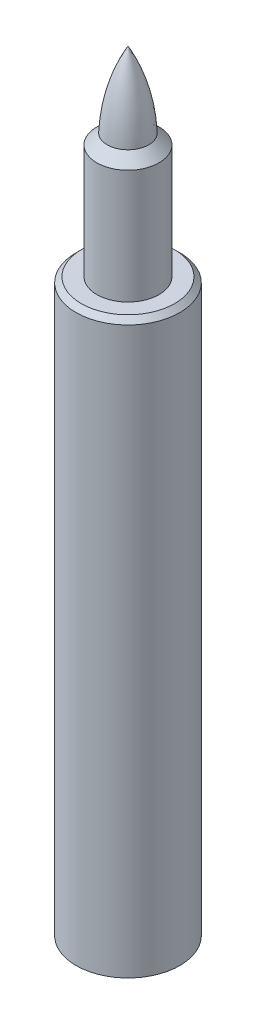
ISO-10303-21;
HEADER;
FILE_DESCRIPTION(('STEP AP214'),'2;1');
FILE_NAME('part.step','',(''),(''),'','','');
FILE_SCHEMA(('AUTOMOTIVE_DESIGN { 1 0 10303 214 1 1 1 1 }'));
ENDSEC;
DATA;
#1=APPLICATION_CONTEXT('core data for automotive mechanical design processes');
#2=APPLICATION_PROTOCOL_DEFINITION('international standard','automotive_design',2000,#1);
#3=PRODUCT_CONTEXT('',#1,'mechanical');
#4=PRODUCT('Part','Part','',(#3));
#5=PRODUCT_RELATED_PRODUCT_CATEGORY('part','',(#4));
#6=PRODUCT_DEFINITION_FORMATION('','',#4);
#7=PRODUCT_DEFINITION_CONTEXT('part definition',#1,'design');
#8=PRODUCT_DEFINITION('design','',#6,#7);
#9=PRODUCT_DEFINITION_SHAPE('','',#8);
#10=(LENGTH_UNIT() NAMED_UNIT(*) SI_UNIT(.MILLI.,.METRE.));
#11=(NAMED_UNIT(*) PLANE_ANGLE_UNIT() SI_UNIT($,.RADIAN.));
#12=(NAMED_UNIT(*) SI_UNIT($,.STERADIAN.) SOLID_ANGLE_UNIT());
#13=UNCERTAINTY_MEASURE_WITH_UNIT(LENGTH_MEASURE(1.E-05),#10,'distance_accuracy_value','');
#14=(GEOMETRIC_REPRESENTATION_CONTEXT(3) GLOBAL_UNCERTAINTY_ASSIGNED_CONTEXT((#13)) GLOBAL_UNIT_ASSIGNED_CONTEXT((#10,
#11,#12)) REPRESENTATION_CONTEXT('',''));
#15=CARTESIAN_POINT('',(0.,0.,0.));
#16=DIRECTION('',(0.,0.,1.));
#17=DIRECTION('',(1.,0.,0.));
#18=AXIS2_PLACEMENT_3D('',#15,#16,#17);
#19=CARTESIAN_POINT('',(0.,110.,0.));
#20=DIRECTION('',(0.,-1.,0.));
#21=DIRECTION('',(0.,0.,-1.));
#22=AXIS2_PLACEMENT_3D('',#19,#20,#21);
#23=CYLINDRICAL_SURFACE('',#22,10.);
#24=CARTESIAN_POINT('',(0.,109.,0.));
#25=DIRECTION('',(0.,1.,0.));
#26=DIRECTION('',(0.,0.,1.));
#27=AXIS2_PLACEMENT_3D('',#24,#25,#26);
#28=CIRCLE('',#27,10.);
#29=CARTESIAN_POINT('',(0.,109.,10.));
#30=VERTEX_POINT('',#29);
#31=EDGE_CURVE('E11',#30,#30,#28,.F.);
#32=ORIENTED_EDGE('',*,*,#31,.T.);
#33=EDGE_LOOP('',(#32));
#34=FACE_BOUND('',#33,.T.);
#35=CARTESIAN_POINT('',(0.,0.,0.));
#36=DIRECTION('',(0.,1.,0.));
#37=DIRECTION('',(0.,0.,1.));
#38=AXIS2_PLACEMENT_3D('',#35,#36,#37);
#39=CIRCLE('',#38,10.);
#40=CARTESIAN_POINT('',(0.,0.,10.));
#41=VERTEX_POINT('',#40);
#42=EDGE_CURVE('E86',#41,#41,#39,.T.);
#43=ORIENTED_EDGE('',*,*,#42,.T.);
#44=EDGE_LOOP('',(#43));
#45=FACE_BOUND('',#44,.T.);
#46=ADVANCED_FACE('F37',(#34,#45),#23,.T.);
#47=CARTESIAN_POINT('',(0.,110.,0.));
#48=DIRECTION('',(0.,1.,0.));
#49=DIRECTION('',(0.,0.,1.));
#50=AXIS2_PLACEMENT_3D('',#47,#48,#49);
#51=PLANE('',#50);
#52=CARTESIAN_POINT('',(0.,110.,0.));
#53=DIRECTION('',(0.,1.,0.));
#54=DIRECTION('',(0.,0.,1.));
#55=AXIS2_PLACEMENT_3D('',#52,#53,#54);
#56=CIRCLE('',#55,9.00000000000004);
#57=CARTESIAN_POINT('',(0.,110.,9.00000000000004));
#58=VERTEX_POINT('',#57);
#59=EDGE_CURVE('E45',#58,#58,#56,.T.);
#60=ORIENTED_EDGE('',*,*,#59,.T.);
#61=EDGE_LOOP('',(#60));
#62=FACE_BOUND('',#61,.T.);
#63=CARTESIAN_POINT('',(0.,110.,0.));
#64=DIRECTION('',(0.,1.,0.));
#65=DIRECTION('',(0.,0.,1.));
#66=AXIS2_PLACEMENT_3D('',#63,#64,#65);
#67=CIRCLE('',#66,6.);
#68=CARTESIAN_POINT('',(0.,110.,6.));
#69=VERTEX_POINT('',#68);
#70=EDGE_CURVE('E87',#69,#69,#67,.T.);
#71=ORIENTED_EDGE('',*,*,#70,.F.);
#72=EDGE_LOOP('',(#71));
#73=FACE_BOUND('',#72,.T.);
#74=ADVANCED_FACE('F65',(#62,#73),#51,.T.);
#75=CARTESIAN_POINT('',(0.,0.,0.));
#76=DIRECTION('',(0.,1.,0.));
#77=DIRECTION('',(0.,0.,1.));
#78=AXIS2_PLACEMENT_3D('',#75,#76,#77);
#79=PLANE('',#78);
#80=ORIENTED_EDGE('',*,*,#42,.F.);
#81=EDGE_LOOP('',(#80));
#82=FACE_BOUND('',#81,.T.);
#83=ADVANCED_FACE('F59',(#82),#79,.F.);
#84=CARTESIAN_POINT('',(0.,134.,0.));
#85=DIRECTION('',(0.,-1.,0.));
#86=DIRECTION('',(0.,0.,-1.));
#87=AXIS2_PLACEMENT_3D('',#84,#85,#86);
#88=CYLINDRICAL_SURFACE('',#87,6.);
#89=CARTESIAN_POINT('',(0.,132.,0.));
#90=DIRECTION('',(0.,1.,0.));
#91=DIRECTION('',(0.,0.,1.));
#92=AXIS2_PLACEMENT_3D('',#89,#90,#91);
#93=CIRCLE('',#92,6.);
#94=CARTESIAN_POINT('',(0.,132.,6.));
#95=VERTEX_POINT('',#94);
#96=EDGE_CURVE('E94',#95,#95,#93,.F.);
#97=ORIENTED_EDGE('',*,*,#96,.T.);
#98=EDGE_LOOP('',(#97));
#99=FACE_BOUND('',#98,.T.);
#100=ORIENTED_EDGE('',*,*,#70,.T.);
#101=EDGE_LOOP('',(#100));
#102=FACE_BOUND('',#101,.T.);
#103=ADVANCED_FACE('F51',(#99,#102),#88,.T.);
#104=CARTESIAN_POINT('',(0.,148.5,0.));
#105=CARTESIAN_POINT('',(0.,141.867546181629,3.66736011336428));
#106=CARTESIAN_POINT('',(0.,134.,4.));
#107=B_SPLINE_CURVE_WITH_KNOTS('',2,(#104,#105,#106),.UNSPECIFIED.,.F.,.F.,(3,3),(0.,1.),.UNSPECIFIED.);
#108=CARTESIAN_POINT('',(0.,134.,0.));
#109=DIRECTION('',(0.,1.,0.));
#110=AXIS1_PLACEMENT('',#108,#109);
#111=SURFACE_OF_REVOLUTION('',#107,#110);
#112=CARTESIAN_POINT('',(0.,134.,0.));
#113=DIRECTION('',(0.,1.,0.));
#114=DIRECTION('',(0.,0.,1.));
#115=AXIS2_PLACEMENT_3D('',#112,#113,#114);
#116=CIRCLE('',#115,4.);
#117=CARTESIAN_POINT('',(0.,134.,4.));
#118=VERTEX_POINT('',#117);
#119=EDGE_CURVE('E90',#118,#118,#116,.T.);
#120=ORIENTED_EDGE('',*,*,#119,.T.);
#121=EDGE_LOOP('',(#120));
#122=FACE_BOUND('',#121,.T.);
#123=CARTESIAN_POINT('',(0.,148.5,0.));
#124=VERTEX_POINT('',#123);
#125=VERTEX_LOOP('',#124);
#126=FACE_BOUND('',#125,.T.);
#127=ADVANCED_FACE('F48',(#122,#126),#111,.F.);
#128=CARTESIAN_POINT('',(0.,134.,0.));
#129=DIRECTION('',(0.,-1.,0.));
#130=DIRECTION('',(0.,0.,-1.));
#131=AXIS2_PLACEMENT_3D('',#128,#129,#130);
#132=CONICAL_SURFACE('',#131,4.00000000000003,0.785398163397447);
#133=ORIENTED_EDGE('',*,*,#96,.F.);
#134=EDGE_LOOP('',(#133));
#135=FACE_BOUND('',#134,.T.);
#136=ORIENTED_EDGE('',*,*,#119,.F.);
#137=EDGE_LOOP('',(#136));
#138=FACE_BOUND('',#137,.T.);
#139=ADVANCED_FACE('F50',(#135,#138),#132,.T.);
#140=CARTESIAN_POINT('',(0.,110.,0.));
#141=DIRECTION('',(0.,-1.,0.));
#142=DIRECTION('',(0.,0.,-1.));
#143=AXIS2_PLACEMENT_3D('',#140,#141,#142);
#144=CONICAL_SURFACE('',#143,9.00000000000004,0.785398163397444);
#145=ORIENTED_EDGE('',*,*,#31,.F.);
#146=EDGE_LOOP('',(#145));
#147=FACE_BOUND('',#146,.T.);
#148=ORIENTED_EDGE('',*,*,#59,.F.);
#149=EDGE_LOOP('',(#148));
#150=FACE_BOUND('',#149,.T.);
#151=ADVANCED_FACE('F40',(#147,#150),#144,.T.);
#152=CLOSED_SHELL('',(#46,#74,#83,#103,#127,#139,#151));
#153=MANIFOLD_SOLID_BREP('B2',#152);
#154=ADVANCED_BREP_SHAPE_REPRESENTATION('',(#18,#153),#14);
#155=SHAPE_DEFINITION_REPRESENTATION(#9,#154);
ENDSEC;
END-ISO-10303-21;
